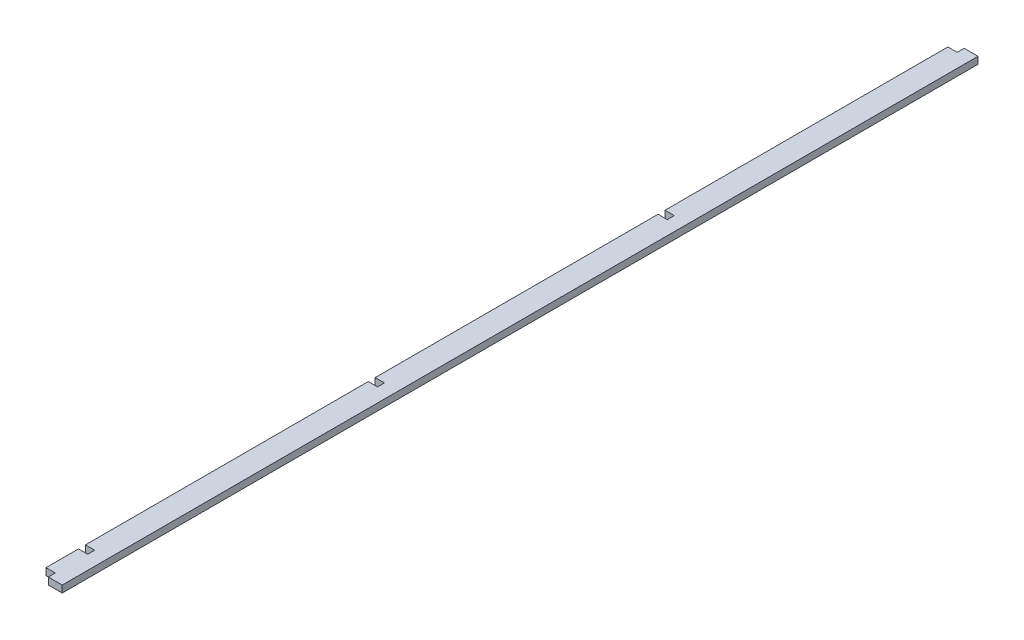
ISO-10303-21;
HEADER;
FILE_DESCRIPTION(('STEP AP214'),'2;1');
FILE_NAME('part.step','',(''),(''),'','','');
FILE_SCHEMA(('AUTOMOTIVE_DESIGN { 1 0 10303 214 1 1 1 1 }'));
ENDSEC;
DATA;
#1=APPLICATION_CONTEXT('core data for automotive mechanical design processes');
#2=APPLICATION_PROTOCOL_DEFINITION('international standard','automotive_design',2000,#1);
#3=PRODUCT_CONTEXT('',#1,'mechanical');
#4=PRODUCT('Part','Part','',(#3));
#5=PRODUCT_RELATED_PRODUCT_CATEGORY('part','',(#4));
#6=PRODUCT_DEFINITION_FORMATION('','',#4);
#7=PRODUCT_DEFINITION_CONTEXT('part definition',#1,'design');
#8=PRODUCT_DEFINITION('design','',#6,#7);
#9=PRODUCT_DEFINITION_SHAPE('','',#8);
#10=(LENGTH_UNIT() NAMED_UNIT(*) SI_UNIT(.MILLI.,.METRE.));
#11=(NAMED_UNIT(*) PLANE_ANGLE_UNIT() SI_UNIT($,.RADIAN.));
#12=(NAMED_UNIT(*) SI_UNIT($,.STERADIAN.) SOLID_ANGLE_UNIT());
#13=UNCERTAINTY_MEASURE_WITH_UNIT(LENGTH_MEASURE(1.E-05),#10,'distance_accuracy_value','');
#14=(GEOMETRIC_REPRESENTATION_CONTEXT(3) GLOBAL_UNCERTAINTY_ASSIGNED_CONTEXT((#13)) GLOBAL_UNIT_ASSIGNED_CONTEXT((#10,
#11,#12)) REPRESENTATION_CONTEXT('',''));
#15=CARTESIAN_POINT('',(0.,0.,0.));
#16=DIRECTION('',(0.,0.,1.));
#17=DIRECTION('',(1.,0.,0.));
#18=AXIS2_PLACEMENT_3D('',#15,#16,#17);
#19=CARTESIAN_POINT('',(120.787596037725,-3.38969409663407,765.01));
#20=DIRECTION('',(-1.,0.,0.));
#21=DIRECTION('',(0.,0.,1.));
#22=AXIS2_PLACEMENT_3D('',#19,#20,#21);
#23=PLANE('',#22);
#24=DIRECTION('',(0.,1.,0.));
#25=VECTOR('',#24,1.);
#26=CARTESIAN_POINT('',(120.787596037729,-6.38969409663407,1140.01));
#27=LINE('',#26,#25);
#28=CARTESIAN_POINT('',(120.787596037729,-6.38969409663407,1140.01));
#29=VERTEX_POINT('',#28);
#30=CARTESIAN_POINT('',(120.787596037729,-3.38969409663407,1140.01));
#31=VERTEX_POINT('',#30);
#32=EDGE_CURVE('E313',#29,#31,#27,.T.);
#33=ORIENTED_EDGE('',*,*,#32,.T.);
#34=DIRECTION('',(0.,0.,1.));
#35=VECTOR('',#34,1.);
#36=CARTESIAN_POINT('',(120.787596037725,-3.38969409663407,765.01));
#37=LINE('',#36,#35);
#38=CARTESIAN_POINT('',(120.787596037725,-3.38969409663407,1018.01));
#39=VERTEX_POINT('',#38);
#40=EDGE_CURVE('E223',#39,#31,#37,.T.);
#41=ORIENTED_EDGE('',*,*,#40,.F.);
#42=DIRECTION('',(0.,1.,0.));
#43=VECTOR('',#42,1.);
#44=CARTESIAN_POINT('',(120.787596037728,-6.38969409663407,1018.01));
#45=LINE('',#44,#43);
#46=CARTESIAN_POINT('',(120.787596037728,-6.38969409663407,1018.01));
#47=VERTEX_POINT('',#46);
#48=EDGE_CURVE('E66',#47,#39,#45,.T.);
#49=ORIENTED_EDGE('',*,*,#48,.F.);
#50=DIRECTION('',(0.,0.,1.));
#51=VECTOR('',#50,1.);
#52=CARTESIAN_POINT('',(120.787596037725,-6.38969409663407,765.01));
#53=LINE('',#52,#51);
#54=EDGE_CURVE('E212',#47,#29,#53,.T.);
#55=ORIENTED_EDGE('',*,*,#54,.T.);
#56=EDGE_LOOP('',(#33,#41,#49,#55));
#57=FACE_BOUND('',#56,.T.);
#58=ADVANCED_FACE('F41',(#57),#23,.T.);
#59=DIRECTION('',(0.,1.,0.));
#60=VECTOR('',#59,1.);
#61=CARTESIAN_POINT('',(120.787596037728,-6.38969409663407,1015.01));
#62=LINE('',#61,#60);
#63=CARTESIAN_POINT('',(120.787596037728,-6.38969409663407,1015.01));
#64=VERTEX_POINT('',#63);
#65=CARTESIAN_POINT('',(120.787596037728,-3.38969409663407,1015.01));
#66=VERTEX_POINT('',#65);
#67=EDGE_CURVE('E308',#64,#66,#62,.T.);
#68=ORIENTED_EDGE('',*,*,#67,.T.);
#69=CARTESIAN_POINT('',(120.787596037725,-3.38969409663407,893.01));
#70=VERTEX_POINT('',#69);
#71=EDGE_CURVE('E218',#70,#66,#37,.T.);
#72=ORIENTED_EDGE('',*,*,#71,.F.);
#73=DIRECTION('',(0.,1.,0.));
#74=VECTOR('',#73,1.);
#75=CARTESIAN_POINT('',(120.787596037726,-6.38969409663407,893.01));
#76=LINE('',#75,#74);
#77=CARTESIAN_POINT('',(120.787596037726,-6.38969409663407,893.01));
#78=VERTEX_POINT('',#77);
#79=EDGE_CURVE('E281',#78,#70,#76,.T.);
#80=ORIENTED_EDGE('',*,*,#79,.F.);
#81=EDGE_CURVE('E208',#78,#64,#53,.T.);
#82=ORIENTED_EDGE('',*,*,#81,.T.);
#83=EDGE_LOOP('',(#68,#72,#80,#82));
#84=FACE_BOUND('',#83,.T.);
#85=ADVANCED_FACE('F385',(#84),#23,.T.);
#86=DIRECTION('',(0.,1.,0.));
#87=VECTOR('',#86,1.);
#88=CARTESIAN_POINT('',(120.787596037725,-6.38969409663407,768.01));
#89=LINE('',#88,#87);
#90=CARTESIAN_POINT('',(120.787596037725,-6.38969409663407,768.01));
#91=VERTEX_POINT('',#90);
#92=CARTESIAN_POINT('',(120.787596037725,-3.38969409663407,768.01));
#93=VERTEX_POINT('',#92);
#94=EDGE_CURVE('E185',#91,#93,#89,.T.);
#95=ORIENTED_EDGE('',*,*,#94,.F.);
#96=CARTESIAN_POINT('',(120.787596037726,-6.38969409663407,890.01));
#97=VERTEX_POINT('',#96);
#98=EDGE_CURVE('E50',#91,#97,#53,.T.);
#99=ORIENTED_EDGE('',*,*,#98,.T.);
#100=DIRECTION('',(0.,1.,0.));
#101=VECTOR('',#100,1.);
#102=CARTESIAN_POINT('',(120.787596037726,-6.38969409663407,890.01));
#103=LINE('',#102,#101);
#104=CARTESIAN_POINT('',(120.787596037726,-3.38969409663407,890.01));
#105=VERTEX_POINT('',#104);
#106=EDGE_CURVE('E266',#97,#105,#103,.T.);
#107=ORIENTED_EDGE('',*,*,#106,.T.);
#108=EDGE_CURVE('E201',#93,#105,#37,.T.);
#109=ORIENTED_EDGE('',*,*,#108,.F.);
#110=EDGE_LOOP('',(#95,#99,#107,#109));
#111=FACE_BOUND('',#110,.T.);
#112=ADVANCED_FACE('F198',(#111),#23,.T.);
#113=CARTESIAN_POINT('',(130.787596037725,-3.38969409663407,765.01));
#114=DIRECTION('',(1.,0.,0.));
#115=DIRECTION('',(0.,0.,-1.));
#116=AXIS2_PLACEMENT_3D('',#113,#114,#115);
#117=PLANE('',#116);
#118=DIRECTION('',(0.,1.,0.));
#119=VECTOR('',#118,1.);
#120=CARTESIAN_POINT('',(130.787596037725,-3.38969409663407,1160.01));
#121=LINE('',#120,#119);
#122=CARTESIAN_POINT('',(130.787596037725,-6.38969409663407,1160.01));
#123=VERTEX_POINT('',#122);
#124=CARTESIAN_POINT('',(130.787596037725,-3.38969409663407,1160.01));
#125=VERTEX_POINT('',#124);
#126=EDGE_CURVE('E242',#123,#125,#121,.T.);
#127=ORIENTED_EDGE('',*,*,#126,.F.);
#128=DIRECTION('',(0.,0.,1.));
#129=VECTOR('',#128,1.);
#130=CARTESIAN_POINT('',(130.787596037725,-6.38969409663407,765.01));
#131=LINE('',#130,#129);
#132=CARTESIAN_POINT('',(130.787596037725,-6.38969409663407,765.01));
#133=VERTEX_POINT('',#132);
#134=EDGE_CURVE('E11',#133,#123,#131,.T.);
#135=ORIENTED_EDGE('',*,*,#134,.F.);
#136=DIRECTION('',(0.,1.,0.));
#137=VECTOR('',#136,1.);
#138=CARTESIAN_POINT('',(130.787596037725,-3.38969409663407,765.01));
#139=LINE('',#138,#137);
#140=CARTESIAN_POINT('',(130.787596037725,-3.38969409663407,765.01));
#141=VERTEX_POINT('',#140);
#142=EDGE_CURVE('E238',#133,#141,#139,.T.);
#143=ORIENTED_EDGE('',*,*,#142,.T.);
#144=DIRECTION('',(0.,0.,1.));
#145=VECTOR('',#144,1.);
#146=CARTESIAN_POINT('',(130.787596037725,-3.38969409663407,765.01));
#147=LINE('',#146,#145);
#148=EDGE_CURVE('E45',#141,#125,#147,.T.);
#149=ORIENTED_EDGE('',*,*,#148,.T.);
#150=EDGE_LOOP('',(#127,#135,#143,#149));
#151=FACE_BOUND('',#150,.T.);
#152=ADVANCED_FACE('F43',(#151),#117,.T.);
#153=CARTESIAN_POINT('',(130.787596037725,-6.38969409663407,765.01));
#154=DIRECTION('',(0.,-1.,0.));
#155=DIRECTION('',(0.,0.,-1.));
#156=AXIS2_PLACEMENT_3D('',#153,#154,#155);
#157=PLANE('',#156);
#158=DIRECTION('',(0.,0.,-1.));
#159=VECTOR('',#158,1.);
#160=CARTESIAN_POINT('',(124.787596037725,-6.38969409663407,765.01));
#161=LINE('',#160,#159);
#162=CARTESIAN_POINT('',(124.787596037725,-6.38969409663407,768.01));
#163=VERTEX_POINT('',#162);
#164=CARTESIAN_POINT('',(124.787596037725,-6.38969409663407,765.01));
#165=VERTEX_POINT('',#164);
#166=EDGE_CURVE('E192',#163,#165,#161,.T.);
#167=ORIENTED_EDGE('',*,*,#166,.T.);
#168=DIRECTION('',(1.,0.,0.));
#169=VECTOR('',#168,1.);
#170=CARTESIAN_POINT('',(130.787596037725,-6.38969409663407,765.01));
#171=LINE('',#170,#169);
#172=EDGE_CURVE('E228',#165,#133,#171,.T.);
#173=ORIENTED_EDGE('',*,*,#172,.T.);
#174=ORIENTED_EDGE('',*,*,#134,.T.);
#175=DIRECTION('',(1.,0.,0.));
#176=VECTOR('',#175,1.);
#177=CARTESIAN_POINT('',(130.787596037725,-6.38969409663407,1160.01));
#178=LINE('',#177,#176);
#179=CARTESIAN_POINT('',(124.787596037725,-6.38969409663407,1160.01));
#180=VERTEX_POINT('',#179);
#181=EDGE_CURVE('E249',#180,#123,#178,.T.);
#182=ORIENTED_EDGE('',*,*,#181,.F.);
#183=DIRECTION('',(0.,0.,-1.));
#184=VECTOR('',#183,1.);
#185=CARTESIAN_POINT('',(124.787596037725,-6.38969409663407,1160.01));
#186=LINE('',#185,#184);
#187=CARTESIAN_POINT('',(124.787596037725,-6.38969409663407,1157.01));
#188=VERTEX_POINT('',#187);
#189=EDGE_CURVE('E255',#180,#188,#186,.T.);
#190=ORIENTED_EDGE('',*,*,#189,.T.);
#191=DIRECTION('',(-1.,0.,0.));
#192=VECTOR('',#191,1.);
#193=CARTESIAN_POINT('',(124.787596037725,-6.38969409663407,1157.01));
#194=LINE('',#193,#192);
#195=CARTESIAN_POINT('',(120.787596037725,-6.38969409663407,1157.01));
#196=VERTEX_POINT('',#195);
#197=EDGE_CURVE('E259',#188,#196,#194,.T.);
#198=ORIENTED_EDGE('',*,*,#197,.T.);
#199=CARTESIAN_POINT('',(120.787596037729,-6.38969409663407,1143.01));
#200=VERTEX_POINT('',#199);
#201=EDGE_CURVE('E210',#200,#196,#53,.T.);
#202=ORIENTED_EDGE('',*,*,#201,.F.);
#203=DIRECTION('',(1.,0.,0.));
#204=VECTOR('',#203,1.);
#205=CARTESIAN_POINT('',(120.787596037729,-6.38969409663407,1143.01));
#206=LINE('',#205,#204);
#207=CARTESIAN_POINT('',(124.787596037729,-6.38969409663407,1143.01));
#208=VERTEX_POINT('',#207);
#209=EDGE_CURVE('E296',#200,#208,#206,.T.);
#210=ORIENTED_EDGE('',*,*,#209,.T.);
#211=DIRECTION('',(0.,0.,-1.));
#212=VECTOR('',#211,1.);
#213=CARTESIAN_POINT('',(124.787596037729,-6.38969409663407,1140.01));
#214=LINE('',#213,#212);
#215=CARTESIAN_POINT('',(124.787596037729,-6.38969409663407,1140.01));
#216=VERTEX_POINT('',#215);
#217=EDGE_CURVE('E300',#208,#216,#214,.T.);
#218=ORIENTED_EDGE('',*,*,#217,.T.);
#219=DIRECTION('',(-1.,0.,0.));
#220=VECTOR('',#219,1.);
#221=CARTESIAN_POINT('',(120.787596037729,-6.38969409663407,1140.01));
#222=LINE('',#221,#220);
#223=EDGE_CURVE('E303',#216,#29,#222,.T.);
#224=ORIENTED_EDGE('',*,*,#223,.T.);
#225=ORIENTED_EDGE('',*,*,#54,.F.);
#226=DIRECTION('',(1.,0.,0.));
#227=VECTOR('',#226,1.);
#228=CARTESIAN_POINT('',(120.787596037728,-6.38969409663407,1018.01));
#229=LINE('',#228,#227);
#230=CARTESIAN_POINT('',(124.787596037727,-6.38969409663407,1018.01));
#231=VERTEX_POINT('',#230);
#232=EDGE_CURVE('E321',#47,#231,#229,.T.);
#233=ORIENTED_EDGE('',*,*,#232,.T.);
#234=DIRECTION('',(0.,0.,-1.));
#235=VECTOR('',#234,1.);
#236=CARTESIAN_POINT('',(124.787596037727,-6.38969409663407,1015.01));
#237=LINE('',#236,#235);
#238=CARTESIAN_POINT('',(124.787596037727,-6.38969409663407,1015.01));
#239=VERTEX_POINT('',#238);
#240=EDGE_CURVE('E325',#231,#239,#237,.T.);
#241=ORIENTED_EDGE('',*,*,#240,.T.);
#242=DIRECTION('',(-1.,0.,0.));
#243=VECTOR('',#242,1.);
#244=CARTESIAN_POINT('',(120.787596037728,-6.38969409663407,1015.01));
#245=LINE('',#244,#243);
#246=EDGE_CURVE('E328',#239,#64,#245,.T.);
#247=ORIENTED_EDGE('',*,*,#246,.T.);
#248=ORIENTED_EDGE('',*,*,#81,.F.);
#249=DIRECTION('',(1.,0.,0.));
#250=VECTOR('',#249,1.);
#251=CARTESIAN_POINT('',(120.787596037726,-6.38969409663407,893.01));
#252=LINE('',#251,#250);
#253=CARTESIAN_POINT('',(124.787596037726,-6.38969409663407,893.01));
#254=VERTEX_POINT('',#253);
#255=EDGE_CURVE('E274',#78,#254,#252,.T.);
#256=ORIENTED_EDGE('',*,*,#255,.T.);
#257=DIRECTION('',(0.,0.,-1.));
#258=VECTOR('',#257,1.);
#259=CARTESIAN_POINT('',(124.787596037726,-6.38969409663407,890.01));
#260=LINE('',#259,#258);
#261=CARTESIAN_POINT('',(124.787596037726,-6.38969409663407,890.01));
#262=VERTEX_POINT('',#261);
#263=EDGE_CURVE('E278',#254,#262,#260,.T.);
#264=ORIENTED_EDGE('',*,*,#263,.T.);
#265=DIRECTION('',(-1.,0.,0.));
#266=VECTOR('',#265,1.);
#267=CARTESIAN_POINT('',(120.787596037726,-6.38969409663407,890.01));
#268=LINE('',#267,#266);
#269=EDGE_CURVE('E207',#262,#97,#268,.T.);
#270=ORIENTED_EDGE('',*,*,#269,.T.);
#271=ORIENTED_EDGE('',*,*,#98,.F.);
#272=DIRECTION('',(1.,0.,0.));
#273=VECTOR('',#272,1.);
#274=CARTESIAN_POINT('',(120.787596037725,-6.38969409663407,768.01));
#275=LINE('',#274,#273);
#276=EDGE_CURVE('E181',#91,#163,#275,.T.);
#277=ORIENTED_EDGE('',*,*,#276,.T.);
#278=EDGE_LOOP('',(#167,#173,#174,#182,#190,#198,#202,#210,#218,#224,#225,#233,#241,#247,#248,
#256,#264,#270,#271,#277));
#279=FACE_BOUND('',#278,.T.);
#280=ADVANCED_FACE('F204',(#279),#157,.T.);
#281=DIRECTION('',(0.,1.,0.));
#282=VECTOR('',#281,1.);
#283=CARTESIAN_POINT('',(120.787596037729,-6.38969409663407,1143.01));
#284=LINE('',#283,#282);
#285=CARTESIAN_POINT('',(120.787596037725,-3.38969409663407,1143.01));
#286=VERTEX_POINT('',#285);
#287=EDGE_CURVE('E58',#200,#286,#284,.T.);
#288=ORIENTED_EDGE('',*,*,#287,.F.);
#289=ORIENTED_EDGE('',*,*,#201,.T.);
#290=DIRECTION('',(0.,1.,0.));
#291=VECTOR('',#290,1.);
#292=CARTESIAN_POINT('',(120.787596037725,-6.38969409663407,1157.01));
#293=LINE('',#292,#291);
#294=CARTESIAN_POINT('',(120.787596037725,-3.38969409663407,1157.01));
#295=VERTEX_POINT('',#294);
#296=EDGE_CURVE('E270',#196,#295,#293,.T.);
#297=ORIENTED_EDGE('',*,*,#296,.T.);
#298=EDGE_CURVE('E219',#286,#295,#37,.T.);
#299=ORIENTED_EDGE('',*,*,#298,.F.);
#300=EDGE_LOOP('',(#288,#289,#297,#299));
#301=FACE_BOUND('',#300,.T.);
#302=ADVANCED_FACE('F361',(#301),#23,.T.);
#303=CARTESIAN_POINT('',(130.787596037725,-3.38969409663407,765.01));
#304=DIRECTION('',(0.,1.,0.));
#305=DIRECTION('',(-1.,0.,0.));
#306=AXIS2_PLACEMENT_3D('',#303,#304,#305);
#307=PLANE('',#306);
#308=DIRECTION('',(0.,0.,-1.));
#309=VECTOR('',#308,1.);
#310=CARTESIAN_POINT('',(124.787596037725,-3.38969409663407,765.01));
#311=LINE('',#310,#309);
#312=CARTESIAN_POINT('',(124.787596037725,-3.38969409663407,768.01));
#313=VERTEX_POINT('',#312);
#314=CARTESIAN_POINT('',(124.787596037725,-3.38969409663407,765.01));
#315=VERTEX_POINT('',#314);
#316=EDGE_CURVE('E193',#313,#315,#311,.T.);
#317=ORIENTED_EDGE('',*,*,#316,.F.);
#318=DIRECTION('',(1.,0.,0.));
#319=VECTOR('',#318,1.);
#320=CARTESIAN_POINT('',(120.787596037725,-3.38969409663407,768.01));
#321=LINE('',#320,#319);
#322=EDGE_CURVE('E285',#93,#313,#321,.T.);
#323=ORIENTED_EDGE('',*,*,#322,.F.);
#324=ORIENTED_EDGE('',*,*,#108,.T.);
#325=DIRECTION('',(-1.,0.,0.));
#326=VECTOR('',#325,1.);
#327=CARTESIAN_POINT('',(120.787596037726,-3.38969409663407,890.01));
#328=LINE('',#327,#326);
#329=CARTESIAN_POINT('',(124.787596037726,-3.38969409663407,890.01));
#330=VERTEX_POINT('',#329);
#331=EDGE_CURVE('E277',#330,#105,#328,.T.);
#332=ORIENTED_EDGE('',*,*,#331,.F.);
#333=DIRECTION('',(0.,0.,-1.));
#334=VECTOR('',#333,1.);
#335=CARTESIAN_POINT('',(124.787596037726,-3.38969409663407,890.01));
#336=LINE('',#335,#334);
#337=CARTESIAN_POINT('',(124.787596037726,-3.38969409663407,893.01));
#338=VERTEX_POINT('',#337);
#339=EDGE_CURVE('E286',#338,#330,#336,.T.);
#340=ORIENTED_EDGE('',*,*,#339,.F.);
#341=DIRECTION('',(1.,0.,0.));
#342=VECTOR('',#341,1.);
#343=CARTESIAN_POINT('',(120.787596037726,-3.38969409663407,893.01));
#344=LINE('',#343,#342);
#345=EDGE_CURVE('E282',#70,#338,#344,.T.);
#346=ORIENTED_EDGE('',*,*,#345,.F.);
#347=ORIENTED_EDGE('',*,*,#71,.T.);
#348=DIRECTION('',(-1.,0.,0.));
#349=VECTOR('',#348,1.);
#350=CARTESIAN_POINT('',(120.787596037728,-3.38969409663407,1015.01));
#351=LINE('',#350,#349);
#352=CARTESIAN_POINT('',(124.787596037727,-3.38969409663407,1015.01));
#353=VERTEX_POINT('',#352);
#354=EDGE_CURVE('E324',#353,#66,#351,.T.);
#355=ORIENTED_EDGE('',*,*,#354,.F.);
#356=DIRECTION('',(0.,0.,-1.));
#357=VECTOR('',#356,1.);
#358=CARTESIAN_POINT('',(124.787596037727,-3.38969409663407,1015.01));
#359=LINE('',#358,#357);
#360=CARTESIAN_POINT('',(124.787596037727,-3.38969409663407,1018.01));
#361=VERTEX_POINT('',#360);
#362=EDGE_CURVE('E332',#361,#353,#359,.T.);
#363=ORIENTED_EDGE('',*,*,#362,.F.);
#364=DIRECTION('',(1.,0.,0.));
#365=VECTOR('',#364,1.);
#366=CARTESIAN_POINT('',(120.787596037728,-3.38969409663407,1018.01));
#367=LINE('',#366,#365);
#368=EDGE_CURVE('E271',#39,#361,#367,.T.);
#369=ORIENTED_EDGE('',*,*,#368,.F.);
#370=ORIENTED_EDGE('',*,*,#40,.T.);
#371=DIRECTION('',(-1.,0.,0.));
#372=VECTOR('',#371,1.);
#373=CARTESIAN_POINT('',(120.787596037729,-3.38969409663407,1140.01));
#374=LINE('',#373,#372);
#375=CARTESIAN_POINT('',(124.787596037729,-3.38969409663407,1140.01));
#376=VERTEX_POINT('',#375);
#377=EDGE_CURVE('E299',#376,#31,#374,.T.);
#378=ORIENTED_EDGE('',*,*,#377,.F.);
#379=DIRECTION('',(0.,0.,-1.));
#380=VECTOR('',#379,1.);
#381=CARTESIAN_POINT('',(124.787596037729,-3.38969409663407,1140.01));
#382=LINE('',#381,#380);
#383=CARTESIAN_POINT('',(124.787596037729,-3.38969409663407,1143.01));
#384=VERTEX_POINT('',#383);
#385=EDGE_CURVE('E309',#384,#376,#382,.T.);
#386=ORIENTED_EDGE('',*,*,#385,.F.);
#387=DIRECTION('',(1.,0.,0.));
#388=VECTOR('',#387,1.);
#389=CARTESIAN_POINT('',(120.787596037729,-3.38969409663407,1143.01));
#390=LINE('',#389,#388);
#391=EDGE_CURVE('E306',#286,#384,#390,.T.);
#392=ORIENTED_EDGE('',*,*,#391,.F.);
#393=ORIENTED_EDGE('',*,*,#298,.T.);
#394=DIRECTION('',(-1.,0.,0.));
#395=VECTOR('',#394,1.);
#396=CARTESIAN_POINT('',(124.787596037725,-3.38969409663407,1157.01));
#397=LINE('',#396,#395);
#398=CARTESIAN_POINT('',(124.787596037725,-3.38969409663407,1157.01));
#399=VERTEX_POINT('',#398);
#400=EDGE_CURVE('E258',#399,#295,#397,.T.);
#401=ORIENTED_EDGE('',*,*,#400,.F.);
#402=DIRECTION('',(0.,0.,-1.));
#403=VECTOR('',#402,1.);
#404=CARTESIAN_POINT('',(124.787596037725,-3.38969409663407,1160.01));
#405=LINE('',#404,#403);
#406=CARTESIAN_POINT('',(124.787596037725,-3.38969409663407,1160.01));
#407=VERTEX_POINT('',#406);
#408=EDGE_CURVE('E263',#407,#399,#405,.T.);
#409=ORIENTED_EDGE('',*,*,#408,.F.);
#410=DIRECTION('',(-1.,0.,0.));
#411=VECTOR('',#410,1.);
#412=CARTESIAN_POINT('',(130.787596037725,-3.38969409663407,1160.01));
#413=LINE('',#412,#411);
#414=EDGE_CURVE('E245',#125,#407,#413,.T.);
#415=ORIENTED_EDGE('',*,*,#414,.F.);
#416=ORIENTED_EDGE('',*,*,#148,.F.);
#417=DIRECTION('',(-1.,0.,0.));
#418=VECTOR('',#417,1.);
#419=CARTESIAN_POINT('',(130.787596037725,-3.38969409663407,765.01));
#420=LINE('',#419,#418);
#421=EDGE_CURVE('E233',#141,#315,#420,.T.);
#422=ORIENTED_EDGE('',*,*,#421,.T.);
#423=EDGE_LOOP('',(#317,#323,#324,#332,#340,#346,#347,#355,#363,#369,#370,#378,#386,#392,#393,
#401,#409,#415,#416,#422));
#424=FACE_BOUND('',#423,.T.);
#425=ADVANCED_FACE('F353',(#424),#307,.T.);
#426=CARTESIAN_POINT('',(0.,0.,765.01));
#427=DIRECTION('',(0.,0.,-1.));
#428=DIRECTION('',(-1.,0.,0.));
#429=AXIS2_PLACEMENT_3D('',#426,#427,#428);
#430=PLANE('',#429);
#431=DIRECTION('',(0.,1.,0.));
#432=VECTOR('',#431,1.);
#433=CARTESIAN_POINT('',(124.787596037725,-6.38969409663407,765.01));
#434=LINE('',#433,#432);
#435=EDGE_CURVE('E246',#165,#315,#434,.T.);
#436=ORIENTED_EDGE('',*,*,#435,.T.);
#437=ORIENTED_EDGE('',*,*,#421,.F.);
#438=ORIENTED_EDGE('',*,*,#142,.F.);
#439=ORIENTED_EDGE('',*,*,#172,.F.);
#440=EDGE_LOOP('',(#436,#437,#438,#439));
#441=FACE_BOUND('',#440,.T.);
#442=ADVANCED_FACE('F350',(#441),#430,.T.);
#443=CARTESIAN_POINT('',(0.,0.,1160.01));
#444=DIRECTION('',(0.,0.,-1.));
#445=DIRECTION('',(-1.,0.,0.));
#446=AXIS2_PLACEMENT_3D('',#443,#444,#445);
#447=PLANE('',#446);
#448=ORIENTED_EDGE('',*,*,#414,.T.);
#449=DIRECTION('',(0.,1.,0.));
#450=VECTOR('',#449,1.);
#451=CARTESIAN_POINT('',(124.787596037725,-6.38969409663407,1160.01));
#452=LINE('',#451,#450);
#453=EDGE_CURVE('E268',#180,#407,#452,.T.);
#454=ORIENTED_EDGE('',*,*,#453,.F.);
#455=ORIENTED_EDGE('',*,*,#181,.T.);
#456=ORIENTED_EDGE('',*,*,#126,.T.);
#457=EDGE_LOOP('',(#448,#454,#455,#456));
#458=FACE_BOUND('',#457,.T.);
#459=ADVANCED_FACE('F355',(#458),#447,.F.);
#460=CARTESIAN_POINT('',(124.787596037725,-6.38969409663407,1160.01));
#461=DIRECTION('',(1.,0.,0.));
#462=DIRECTION('',(0.,1.,0.));
#463=AXIS2_PLACEMENT_3D('',#460,#461,#462);
#464=PLANE('',#463);
#465=ORIENTED_EDGE('',*,*,#408,.T.);
#466=DIRECTION('',(0.,1.,0.));
#467=VECTOR('',#466,1.);
#468=CARTESIAN_POINT('',(124.787596037725,-6.38969409663407,1157.01));
#469=LINE('',#468,#467);
#470=EDGE_CURVE('E262',#188,#399,#469,.T.);
#471=ORIENTED_EDGE('',*,*,#470,.F.);
#472=ORIENTED_EDGE('',*,*,#189,.F.);
#473=ORIENTED_EDGE('',*,*,#453,.T.);
#474=EDGE_LOOP('',(#465,#471,#472,#473));
#475=FACE_BOUND('',#474,.T.);
#476=ADVANCED_FACE('F358',(#475),#464,.F.);
#477=CARTESIAN_POINT('',(124.787596037725,-6.38969409663407,1157.01));
#478=DIRECTION('',(0.,0.,-1.));
#479=DIRECTION('',(-1.,0.,0.));
#480=AXIS2_PLACEMENT_3D('',#477,#478,#479);
#481=PLANE('',#480);
#482=ORIENTED_EDGE('',*,*,#400,.T.);
#483=ORIENTED_EDGE('',*,*,#296,.F.);
#484=ORIENTED_EDGE('',*,*,#197,.F.);
#485=ORIENTED_EDGE('',*,*,#470,.T.);
#486=EDGE_LOOP('',(#482,#483,#484,#485));
#487=FACE_BOUND('',#486,.T.);
#488=ADVANCED_FACE('F360',(#487),#481,.F.);
#489=CARTESIAN_POINT('',(124.787596037725,-6.38969409663407,765.01));
#490=DIRECTION('',(1.,0.,0.));
#491=DIRECTION('',(0.,1.,0.));
#492=AXIS2_PLACEMENT_3D('',#489,#490,#491);
#493=PLANE('',#492);
#494=ORIENTED_EDGE('',*,*,#316,.T.);
#495=ORIENTED_EDGE('',*,*,#435,.F.);
#496=ORIENTED_EDGE('',*,*,#166,.F.);
#497=DIRECTION('',(0.,1.,0.));
#498=VECTOR('',#497,1.);
#499=CARTESIAN_POINT('',(124.787596037725,-6.38969409663407,768.01));
#500=LINE('',#499,#498);
#501=EDGE_CURVE('E187',#163,#313,#500,.T.);
#502=ORIENTED_EDGE('',*,*,#501,.T.);
#503=EDGE_LOOP('',(#494,#495,#496,#502));
#504=FACE_BOUND('',#503,.T.);
#505=ADVANCED_FACE('F403',(#504),#493,.F.);
#506=CARTESIAN_POINT('',(120.787596037725,-6.38969409663407,768.01));
#507=DIRECTION('',(0.,0.,1.));
#508=DIRECTION('',(1.,0.,0.));
#509=AXIS2_PLACEMENT_3D('',#506,#507,#508);
#510=PLANE('',#509);
#511=ORIENTED_EDGE('',*,*,#322,.T.);
#512=ORIENTED_EDGE('',*,*,#501,.F.);
#513=ORIENTED_EDGE('',*,*,#276,.F.);
#514=ORIENTED_EDGE('',*,*,#94,.T.);
#515=EDGE_LOOP('',(#511,#512,#513,#514));
#516=FACE_BOUND('',#515,.T.);
#517=ADVANCED_FACE('F184',(#516),#510,.F.);
#518=CARTESIAN_POINT('',(120.787596037726,-6.38969409663407,890.01));
#519=DIRECTION('',(0.,0.,-1.));
#520=DIRECTION('',(-1.,0.,0.));
#521=AXIS2_PLACEMENT_3D('',#518,#519,#520);
#522=PLANE('',#521);
#523=ORIENTED_EDGE('',*,*,#331,.T.);
#524=ORIENTED_EDGE('',*,*,#106,.F.);
#525=ORIENTED_EDGE('',*,*,#269,.F.);
#526=DIRECTION('',(0.,1.,0.));
#527=VECTOR('',#526,1.);
#528=CARTESIAN_POINT('',(124.787596037726,-6.38969409663407,890.01));
#529=LINE('',#528,#527);
#530=EDGE_CURVE('E291',#262,#330,#529,.T.);
#531=ORIENTED_EDGE('',*,*,#530,.T.);
#532=EDGE_LOOP('',(#523,#524,#525,#531));
#533=FACE_BOUND('',#532,.T.);
#534=ADVANCED_FACE('F395',(#533),#522,.F.);
#535=CARTESIAN_POINT('',(124.787596037726,-6.38969409663407,890.01));
#536=DIRECTION('',(1.,0.,0.));
#537=DIRECTION('',(0.,1.,0.));
#538=AXIS2_PLACEMENT_3D('',#535,#536,#537);
#539=PLANE('',#538);
#540=ORIENTED_EDGE('',*,*,#339,.T.);
#541=ORIENTED_EDGE('',*,*,#530,.F.);
#542=ORIENTED_EDGE('',*,*,#263,.F.);
#543=DIRECTION('',(0.,1.,0.));
#544=VECTOR('',#543,1.);
#545=CARTESIAN_POINT('',(124.787596037726,-6.38969409663407,893.01));
#546=LINE('',#545,#544);
#547=EDGE_CURVE('E293',#254,#338,#546,.T.);
#548=ORIENTED_EDGE('',*,*,#547,.T.);
#549=EDGE_LOOP('',(#540,#541,#542,#548));
#550=FACE_BOUND('',#549,.T.);
#551=ADVANCED_FACE('F392',(#550),#539,.F.);
#552=CARTESIAN_POINT('',(120.787596037726,-6.38969409663407,893.01));
#553=DIRECTION('',(0.,0.,1.));
#554=DIRECTION('',(1.,0.,0.));
#555=AXIS2_PLACEMENT_3D('',#552,#553,#554);
#556=PLANE('',#555);
#557=ORIENTED_EDGE('',*,*,#345,.T.);
#558=ORIENTED_EDGE('',*,*,#547,.F.);
#559=ORIENTED_EDGE('',*,*,#255,.F.);
#560=ORIENTED_EDGE('',*,*,#79,.T.);
#561=EDGE_LOOP('',(#557,#558,#559,#560));
#562=FACE_BOUND('',#561,.T.);
#563=ADVANCED_FACE('F389',(#562),#556,.F.);
#564=CARTESIAN_POINT('',(120.787596037728,-6.38969409663407,1015.01));
#565=DIRECTION('',(0.,0.,-1.));
#566=DIRECTION('',(-1.,0.,0.));
#567=AXIS2_PLACEMENT_3D('',#564,#565,#566);
#568=PLANE('',#567);
#569=ORIENTED_EDGE('',*,*,#354,.T.);
#570=ORIENTED_EDGE('',*,*,#67,.F.);
#571=ORIENTED_EDGE('',*,*,#246,.F.);
#572=DIRECTION('',(0.,1.,0.));
#573=VECTOR('',#572,1.);
#574=CARTESIAN_POINT('',(124.787596037727,-6.38969409663407,1015.01));
#575=LINE('',#574,#573);
#576=EDGE_CURVE('E338',#239,#353,#575,.T.);
#577=ORIENTED_EDGE('',*,*,#576,.T.);
#578=EDGE_LOOP('',(#569,#570,#571,#577));
#579=FACE_BOUND('',#578,.T.);
#580=ADVANCED_FACE('F517',(#579),#568,.F.);
#581=CARTESIAN_POINT('',(124.787596037727,-6.38969409663407,1015.01));
#582=DIRECTION('',(1.,0.,0.));
#583=DIRECTION('',(0.,1.,0.));
#584=AXIS2_PLACEMENT_3D('',#581,#582,#583);
#585=PLANE('',#584);
#586=ORIENTED_EDGE('',*,*,#362,.T.);
#587=ORIENTED_EDGE('',*,*,#576,.F.);
#588=ORIENTED_EDGE('',*,*,#240,.F.);
#589=DIRECTION('',(0.,1.,0.));
#590=VECTOR('',#589,1.);
#591=CARTESIAN_POINT('',(124.787596037727,-6.38969409663407,1018.01));
#592=LINE('',#591,#590);
#593=EDGE_CURVE('E340',#231,#361,#592,.T.);
#594=ORIENTED_EDGE('',*,*,#593,.T.);
#595=EDGE_LOOP('',(#586,#587,#588,#594));
#596=FACE_BOUND('',#595,.T.);
#597=ADVANCED_FACE('F379',(#596),#585,.F.);
#598=CARTESIAN_POINT('',(120.787596037728,-6.38969409663407,1018.01));
#599=DIRECTION('',(0.,0.,1.));
#600=DIRECTION('',(1.,0.,0.));
#601=AXIS2_PLACEMENT_3D('',#598,#599,#600);
#602=PLANE('',#601);
#603=ORIENTED_EDGE('',*,*,#368,.T.);
#604=ORIENTED_EDGE('',*,*,#593,.F.);
#605=ORIENTED_EDGE('',*,*,#232,.F.);
#606=ORIENTED_EDGE('',*,*,#48,.T.);
#607=EDGE_LOOP('',(#603,#604,#605,#606));
#608=FACE_BOUND('',#607,.T.);
#609=ADVANCED_FACE('F376',(#608),#602,.F.);
#610=CARTESIAN_POINT('',(120.787596037729,-6.38969409663407,1140.01));
#611=DIRECTION('',(0.,0.,-1.));
#612=DIRECTION('',(-1.,0.,0.));
#613=AXIS2_PLACEMENT_3D('',#610,#611,#612);
#614=PLANE('',#613);
#615=ORIENTED_EDGE('',*,*,#377,.T.);
#616=ORIENTED_EDGE('',*,*,#32,.F.);
#617=ORIENTED_EDGE('',*,*,#223,.F.);
#618=DIRECTION('',(0.,1.,0.));
#619=VECTOR('',#618,1.);
#620=CARTESIAN_POINT('',(124.787596037729,-6.38969409663407,1140.01));
#621=LINE('',#620,#619);
#622=EDGE_CURVE('E316',#216,#376,#621,.T.);
#623=ORIENTED_EDGE('',*,*,#622,.T.);
#624=EDGE_LOOP('',(#615,#616,#617,#623));
#625=FACE_BOUND('',#624,.T.);
#626=ADVANCED_FACE('F370',(#625),#614,.F.);
#627=CARTESIAN_POINT('',(124.787596037729,-6.38969409663407,1140.01));
#628=DIRECTION('',(1.,0.,0.));
#629=DIRECTION('',(0.,1.,0.));
#630=AXIS2_PLACEMENT_3D('',#627,#628,#629);
#631=PLANE('',#630);
#632=ORIENTED_EDGE('',*,*,#385,.T.);
#633=ORIENTED_EDGE('',*,*,#622,.F.);
#634=ORIENTED_EDGE('',*,*,#217,.F.);
#635=DIRECTION('',(0.,1.,0.));
#636=VECTOR('',#635,1.);
#637=CARTESIAN_POINT('',(124.787596037729,-6.38969409663407,1143.01));
#638=LINE('',#637,#636);
#639=EDGE_CURVE('E318',#208,#384,#638,.T.);
#640=ORIENTED_EDGE('',*,*,#639,.T.);
#641=EDGE_LOOP('',(#632,#633,#634,#640));
#642=FACE_BOUND('',#641,.T.);
#643=ADVANCED_FACE('F366',(#642),#631,.F.);
#644=CARTESIAN_POINT('',(120.787596037729,-6.38969409663407,1143.01));
#645=DIRECTION('',(0.,0.,1.));
#646=DIRECTION('',(1.,0.,0.));
#647=AXIS2_PLACEMENT_3D('',#644,#645,#646);
#648=PLANE('',#647);
#649=ORIENTED_EDGE('',*,*,#391,.T.);
#650=ORIENTED_EDGE('',*,*,#639,.F.);
#651=ORIENTED_EDGE('',*,*,#209,.F.);
#652=ORIENTED_EDGE('',*,*,#287,.T.);
#653=EDGE_LOOP('',(#649,#650,#651,#652));
#654=FACE_BOUND('',#653,.T.);
#655=ADVANCED_FACE('F363',(#654),#648,.F.);
#656=CLOSED_SHELL('',(#58,#85,#112,#152,#280,#302,#425,#442,#459,#476,#488,#505,#517,#534,#551,
#563,#580,#597,#609,#626,#643,#655));
#657=MANIFOLD_SOLID_BREP('B2',#656);
#658=ADVANCED_BREP_SHAPE_REPRESENTATION('',(#18,#657),#14);
#659=SHAPE_DEFINITION_REPRESENTATION(#9,#658);
ENDSEC;
END-ISO-10303-21;
